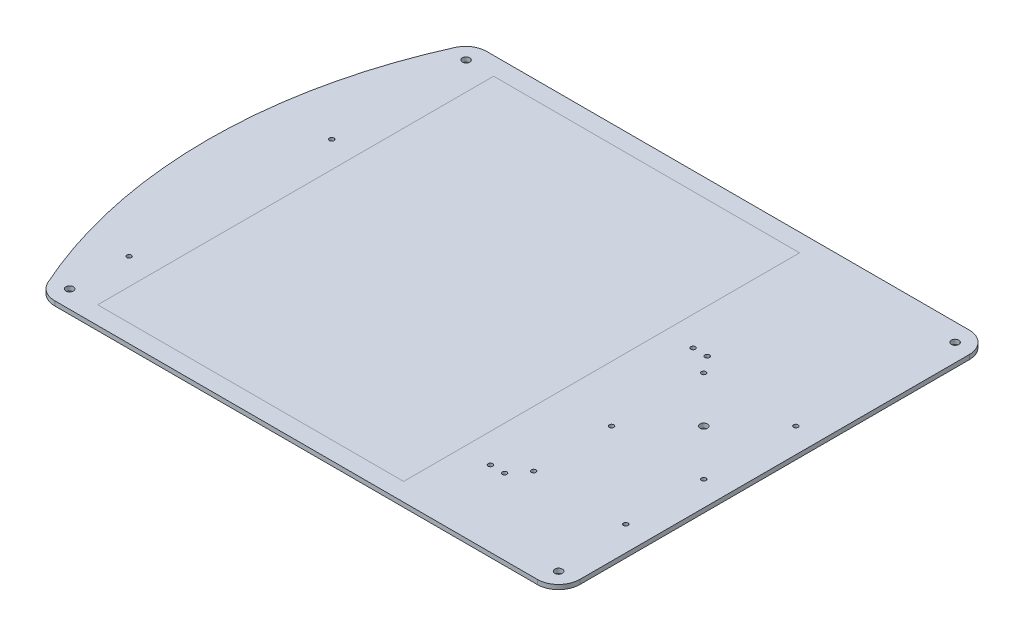
ISO-10303-21;
HEADER;
FILE_DESCRIPTION(('STEP AP214'),'2;1');
FILE_NAME('part.step','',(''),(''),'','','');
FILE_SCHEMA(('AUTOMOTIVE_DESIGN { 1 0 10303 214 1 1 1 1 }'));
ENDSEC;
DATA;
#1=APPLICATION_CONTEXT('core data for automotive mechanical design processes');
#2=APPLICATION_PROTOCOL_DEFINITION('international standard','automotive_design',2000,#1);
#3=PRODUCT_CONTEXT('',#1,'mechanical');
#4=PRODUCT('Part','Part','',(#3));
#5=PRODUCT_RELATED_PRODUCT_CATEGORY('part','',(#4));
#6=PRODUCT_DEFINITION_FORMATION('','',#4);
#7=PRODUCT_DEFINITION_CONTEXT('part definition',#1,'design');
#8=PRODUCT_DEFINITION('design','',#6,#7);
#9=PRODUCT_DEFINITION_SHAPE('','',#8);
#10=(LENGTH_UNIT() NAMED_UNIT(*) SI_UNIT(.MILLI.,.METRE.));
#11=(NAMED_UNIT(*) PLANE_ANGLE_UNIT() SI_UNIT($,.RADIAN.));
#12=(NAMED_UNIT(*) SI_UNIT($,.STERADIAN.) SOLID_ANGLE_UNIT());
#13=UNCERTAINTY_MEASURE_WITH_UNIT(LENGTH_MEASURE(1.E-05),#10,'distance_accuracy_value','');
#14=(GEOMETRIC_REPRESENTATION_CONTEXT(3) GLOBAL_UNCERTAINTY_ASSIGNED_CONTEXT((#13)) GLOBAL_UNIT_ASSIGNED_CONTEXT((#10,
#11,#12)) REPRESENTATION_CONTEXT('',''));
#15=CARTESIAN_POINT('',(0.,0.,0.));
#16=DIRECTION('',(0.,0.,1.));
#17=DIRECTION('',(1.,0.,0.));
#18=AXIS2_PLACEMENT_3D('',#15,#16,#17);
#19=CARTESIAN_POINT('',(0.,0.,0.));
#20=DIRECTION('',(0.,1.,0.));
#21=DIRECTION('',(0.,0.,1.));
#22=AXIS2_PLACEMENT_3D('',#19,#20,#21);
#23=PLANE('',#22);
#24=DIRECTION('',(1.,0.,0.));
#25=VECTOR('',#24,1.);
#26=CARTESIAN_POINT('',(-287.95,0.,139.7));
#27=LINE('',#26,#25);
#28=CARTESIAN_POINT('',(-287.95,0.,139.7));
#29=VERTEX_POINT('',#28);
#30=CARTESIAN_POINT('',(-72.05,0.,139.7));
#31=VERTEX_POINT('',#30);
#32=EDGE_CURVE('E582',#29,#31,#27,.T.);
#33=ORIENTED_EDGE('',*,*,#32,.T.);
#34=DIRECTION('',(0.,0.,-1.));
#35=VECTOR('',#34,1.);
#36=CARTESIAN_POINT('',(-72.0500000000001,0.,-139.7));
#37=LINE('',#36,#35);
#38=CARTESIAN_POINT('',(-72.0500000000001,0.,-139.7));
#39=VERTEX_POINT('',#38);
#40=EDGE_CURVE('E13',#31,#39,#37,.T.);
#41=ORIENTED_EDGE('',*,*,#40,.T.);
#42=DIRECTION('',(-1.,0.,0.));
#43=VECTOR('',#42,1.);
#44=CARTESIAN_POINT('',(-287.95,0.,-139.7));
#45=LINE('',#44,#43);
#46=CARTESIAN_POINT('',(-287.95,0.,-139.7));
#47=VERTEX_POINT('',#46);
#48=EDGE_CURVE('E709',#39,#47,#45,.T.);
#49=ORIENTED_EDGE('',*,*,#48,.T.);
#50=DIRECTION('',(0.,0.,1.));
#51=VECTOR('',#50,1.);
#52=CARTESIAN_POINT('',(-287.95,0.,-139.7));
#53=LINE('',#52,#51);
#54=EDGE_CURVE('E713',#47,#29,#53,.T.);
#55=ORIENTED_EDGE('',*,*,#54,.T.);
#56=EDGE_LOOP('',(#33,#41,#49,#55));
#57=FACE_BOUND('',#56,.T.);
#58=ADVANCED_FACE('F573',(#57),#23,.T.);
#59=CARTESIAN_POINT('',(0.,-3.175,0.));
#60=DIRECTION('',(0.,1.,0.));
#61=DIRECTION('',(0.,0.,1.));
#62=AXIS2_PLACEMENT_3D('',#59,#60,#61);
#63=PLANE('',#62);
#64=CARTESIAN_POINT('',(-306.5,-3.175,99.0000000000001));
#65=DIRECTION('',(0.,1.,0.));
#66=DIRECTION('',(0.,0.,1.));
#67=AXIS2_PLACEMENT_3D('',#64,#65,#66);
#68=CIRCLE('',#67,1.59999999999997);
#69=CARTESIAN_POINT('',(-306.5,-3.175,100.6));
#70=VERTEX_POINT('',#69);
#71=EDGE_CURVE('E901',#70,#70,#68,.F.);
#72=ORIENTED_EDGE('',*,*,#71,.F.);
#73=EDGE_LOOP('',(#72));
#74=FACE_BOUND('',#73,.T.);
#75=CARTESIAN_POINT('',(-51.5,-3.175,-44.0000000000001));
#76=DIRECTION('',(0.,1.,0.));
#77=DIRECTION('',(0.,0.,1.));
#78=AXIS2_PLACEMENT_3D('',#75,#76,#77);
#79=CIRCLE('',#78,1.6);
#80=CARTESIAN_POINT('',(-51.5,-3.175,-42.4000000000002));
#81=VERTEX_POINT('',#80);
#82=EDGE_CURVE('E900',#81,#81,#79,.F.);
#83=ORIENTED_EDGE('',*,*,#82,.F.);
#84=EDGE_LOOP('',(#83));
#85=FACE_BOUND('',#84,.T.);
#86=CARTESIAN_POINT('',(-41.5,-3.175,-44.0000000000001));
#87=DIRECTION('',(0.,1.,0.));
#88=DIRECTION('',(0.,0.,1.));
#89=AXIS2_PLACEMENT_3D('',#86,#87,#88);
#90=CIRCLE('',#89,1.6);
#91=CARTESIAN_POINT('',(-41.5,-3.175,-42.4000000000002));
#92=VERTEX_POINT('',#91);
#93=EDGE_CURVE('E909',#92,#92,#90,.F.);
#94=ORIENTED_EDGE('',*,*,#93,.F.);
#95=EDGE_LOOP('',(#94));
#96=FACE_BOUND('',#95,.T.);
#97=CARTESIAN_POINT('',(-51.5,-3.175,99.0000000000001));
#98=DIRECTION('',(0.,1.,0.));
#99=DIRECTION('',(0.,0.,1.));
#100=AXIS2_PLACEMENT_3D('',#97,#98,#99);
#101=CIRCLE('',#100,1.6);
#102=CARTESIAN_POINT('',(-51.5,-3.175,100.6));
#103=VERTEX_POINT('',#102);
#104=EDGE_CURVE('E908',#103,#103,#101,.F.);
#105=ORIENTED_EDGE('',*,*,#104,.F.);
#106=EDGE_LOOP('',(#105));
#107=FACE_BOUND('',#106,.T.);
#108=CARTESIAN_POINT('',(-306.5,-3.175,-44.0000000000001));
#109=DIRECTION('',(0.,1.,0.));
#110=DIRECTION('',(0.,0.,1.));
#111=AXIS2_PLACEMENT_3D('',#108,#109,#110);
#112=CIRCLE('',#111,1.59999999999996);
#113=CARTESIAN_POINT('',(-306.5,-3.175,-42.4000000000001));
#114=VERTEX_POINT('',#113);
#115=EDGE_CURVE('E895',#114,#114,#112,.F.);
#116=ORIENTED_EDGE('',*,*,#115,.F.);
#117=EDGE_LOOP('',(#116));
#118=FACE_BOUND('',#117,.T.);
#119=CARTESIAN_POINT('',(-41.5,-3.175,99.0000000000001));
#120=DIRECTION('',(0.,1.,0.));
#121=DIRECTION('',(0.,0.,1.));
#122=AXIS2_PLACEMENT_3D('',#119,#120,#121);
#123=CIRCLE('',#122,1.6);
#124=CARTESIAN_POINT('',(-41.5,-3.175,100.6));
#125=VERTEX_POINT('',#124);
#126=EDGE_CURVE('E916',#125,#125,#123,.F.);
#127=ORIENTED_EDGE('',*,*,#126,.F.);
#128=EDGE_LOOP('',(#127));
#129=FACE_BOUND('',#128,.T.);
#130=DIRECTION('',(0.,0.,1.));
#131=VECTOR('',#130,1.);
#132=CARTESIAN_POINT('',(50.,-3.175,-50.));
#133=LINE('',#132,#131);
#134=CARTESIAN_POINT('',(50.,-3.175,-137.4));
#135=VERTEX_POINT('',#134);
#136=CARTESIAN_POINT('',(50.,-3.175,137.4));
#137=VERTEX_POINT('',#136);
#138=EDGE_CURVE('E787',#135,#137,#133,.T.);
#139=ORIENTED_EDGE('',*,*,#138,.T.);
#140=CARTESIAN_POINT('',(35.,-3.175,137.4));
#141=DIRECTION('',(0.,1.,0.));
#142=DIRECTION('',(0.,0.,1.));
#143=AXIS2_PLACEMENT_3D('',#140,#141,#142);
#144=CIRCLE('',#143,15.);
#145=CARTESIAN_POINT('',(35.,-3.175,152.4));
#146=VERTEX_POINT('',#145);
#147=EDGE_CURVE('E697',#137,#146,#144,.F.);
#148=ORIENTED_EDGE('',*,*,#147,.T.);
#149=DIRECTION('',(-1.,0.,0.));
#150=VECTOR('',#149,1.);
#151=CARTESIAN_POINT('',(50.,-3.175,152.4));
#152=LINE('',#151,#150);
#153=CARTESIAN_POINT('',(-305.526169091945,-3.175,152.4));
#154=VERTEX_POINT('',#153);
#155=EDGE_CURVE('E666',#146,#154,#152,.T.);
#156=ORIENTED_EDGE('',*,*,#155,.T.);
#157=CARTESIAN_POINT('',(-305.526169091945,-3.175,137.4));
#158=DIRECTION('',(0.,1.,0.));
#159=DIRECTION('',(0.,0.,1.));
#160=AXIS2_PLACEMENT_3D('',#157,#158,#159);
#161=CIRCLE('',#160,15.);
#162=CARTESIAN_POINT('',(-319.206445319943,-3.175,143.55223880597));
#163=VERTEX_POINT('',#162);
#164=EDGE_CURVE('E693',#154,#163,#161,.F.);
#165=ORIENTED_EDGE('',*,*,#164,.T.);
#166=CARTESIAN_POINT('',(0.,-3.175,0.));
#167=DIRECTION('',(0.,-1.,0.));
#168=DIRECTION('',(0.,0.,1.));
#169=AXIS2_PLACEMENT_3D('',#166,#167,#168);
#170=CIRCLE('',#169,350.);
#171=CARTESIAN_POINT('',(-319.206445319943,-3.175,-143.55223880597));
#172=VERTEX_POINT('',#171);
#173=EDGE_CURVE('E674',#163,#172,#170,.T.);
#174=ORIENTED_EDGE('',*,*,#173,.T.);
#175=CARTESIAN_POINT('',(-305.526169091945,-3.175,-137.4));
#176=DIRECTION('',(0.,1.,0.));
#177=DIRECTION('',(0.,0.,1.));
#178=AXIS2_PLACEMENT_3D('',#175,#176,#177);
#179=CIRCLE('',#178,15.);
#180=CARTESIAN_POINT('',(-305.526169091945,-3.175,-152.4));
#181=VERTEX_POINT('',#180);
#182=EDGE_CURVE('E691',#172,#181,#179,.F.);
#183=ORIENTED_EDGE('',*,*,#182,.T.);
#184=DIRECTION('',(1.,0.,0.));
#185=VECTOR('',#184,1.);
#186=CARTESIAN_POINT('',(-315.078149036076,-3.175,-152.4));
#187=LINE('',#186,#185);
#188=CARTESIAN_POINT('',(35.,-3.175,-152.4));
#189=VERTEX_POINT('',#188);
#190=EDGE_CURVE('E678',#181,#189,#187,.T.);
#191=ORIENTED_EDGE('',*,*,#190,.T.);
#192=CARTESIAN_POINT('',(35.,-3.175,-137.4));
#193=DIRECTION('',(0.,1.,0.));
#194=DIRECTION('',(0.,0.,1.));
#195=AXIS2_PLACEMENT_3D('',#192,#193,#194);
#196=CIRCLE('',#195,15.);
#197=EDGE_CURVE('E695',#189,#135,#196,.F.);
#198=ORIENTED_EDGE('',*,*,#197,.T.);
#199=EDGE_LOOP('',(#139,#148,#156,#165,#174,#183,#191,#198));
#200=FACE_BOUND('',#199,.T.);
#201=CARTESIAN_POINT('',(32.5,-3.175,-32.5));
#202=DIRECTION('',(0.,-1.,0.));
#203=DIRECTION('',(0.,0.,-1.));
#204=AXIS2_PLACEMENT_3D('',#201,#202,#203);
#205=CIRCLE('',#204,1.6);
#206=CARTESIAN_POINT('',(32.5,-3.175,-34.1));
#207=VERTEX_POINT('',#206);
#208=EDGE_CURVE('E779',#207,#207,#205,.T.);
#209=ORIENTED_EDGE('',*,*,#208,.F.);
#210=EDGE_LOOP('',(#209));
#211=FACE_BOUND('',#210,.T.);
#212=CARTESIAN_POINT('',(32.5,-3.175,32.5));
#213=DIRECTION('',(0.,-1.,0.));
#214=DIRECTION('',(0.,0.,-1.));
#215=AXIS2_PLACEMENT_3D('',#212,#213,#214);
#216=CIRCLE('',#215,1.6);
#217=CARTESIAN_POINT('',(32.5,-3.175,30.9));
#218=VERTEX_POINT('',#217);
#219=EDGE_CURVE('E768',#218,#218,#216,.T.);
#220=ORIENTED_EDGE('',*,*,#219,.F.);
#221=EDGE_LOOP('',(#220));
#222=FACE_BOUND('',#221,.T.);
#223=CARTESIAN_POINT('',(-32.5,-3.175,-32.5));
#224=DIRECTION('',(0.,-1.,0.));
#225=DIRECTION('',(0.,0.,-1.));
#226=AXIS2_PLACEMENT_3D('',#223,#224,#225);
#227=CIRCLE('',#226,1.6);
#228=CARTESIAN_POINT('',(-32.5,-3.175,-34.1));
#229=VERTEX_POINT('',#228);
#230=EDGE_CURVE('E769',#229,#229,#227,.T.);
#231=ORIENTED_EDGE('',*,*,#230,.F.);
#232=EDGE_LOOP('',(#231));
#233=FACE_BOUND('',#232,.T.);
#234=CARTESIAN_POINT('',(-32.5,-3.175,32.5));
#235=DIRECTION('',(0.,-1.,0.));
#236=DIRECTION('',(0.,0.,-1.));
#237=AXIS2_PLACEMENT_3D('',#234,#235,#236);
#238=CIRCLE('',#237,1.6);
#239=CARTESIAN_POINT('',(-32.5,-3.175,30.9));
#240=VERTEX_POINT('',#239);
#241=EDGE_CURVE('E955',#240,#240,#238,.T.);
#242=ORIENTED_EDGE('',*,*,#241,.F.);
#243=EDGE_LOOP('',(#242));
#244=FACE_BOUND('',#243,.T.);
#245=CARTESIAN_POINT('',(-32.5,-3.175,87.5));
#246=DIRECTION('',(0.,-1.,0.));
#247=DIRECTION('',(0.,0.,-1.));
#248=AXIS2_PLACEMENT_3D('',#245,#246,#247);
#249=CIRCLE('',#248,1.6);
#250=CARTESIAN_POINT('',(-32.5,-3.175,85.9));
#251=VERTEX_POINT('',#250);
#252=EDGE_CURVE('E950',#251,#251,#249,.T.);
#253=ORIENTED_EDGE('',*,*,#252,.F.);
#254=EDGE_LOOP('',(#253));
#255=FACE_BOUND('',#254,.T.);
#256=CARTESIAN_POINT('',(32.5,-3.175,87.5));
#257=DIRECTION('',(0.,-1.,0.));
#258=DIRECTION('',(0.,0.,-1.));
#259=AXIS2_PLACEMENT_3D('',#256,#257,#258);
#260=CIRCLE('',#259,1.6);
#261=CARTESIAN_POINT('',(32.5,-3.175,85.9));
#262=VERTEX_POINT('',#261);
#263=EDGE_CURVE('E945',#262,#262,#260,.T.);
#264=ORIENTED_EDGE('',*,*,#263,.F.);
#265=EDGE_LOOP('',(#264));
#266=FACE_BOUND('',#265,.T.);
#267=CARTESIAN_POINT('',(0.,-3.175,0.));
#268=DIRECTION('',(0.,-1.,0.));
#269=DIRECTION('',(0.,0.,-1.));
#270=AXIS2_PLACEMENT_3D('',#267,#268,#269);
#271=CIRCLE('',#270,2.65);
#272=CARTESIAN_POINT('',(0.,-3.175,-2.65));
#273=VERTEX_POINT('',#272);
#274=EDGE_CURVE('E940',#273,#273,#271,.T.);
#275=ORIENTED_EDGE('',*,*,#274,.F.);
#276=EDGE_LOOP('',(#275));
#277=FACE_BOUND('',#276,.T.);
#278=CARTESIAN_POINT('',(37.5,-3.175,-139.9));
#279=DIRECTION('',(0.,-1.,0.));
#280=DIRECTION('',(0.,0.,-1.));
#281=AXIS2_PLACEMENT_3D('',#278,#279,#280);
#282=CIRCLE('',#281,2.65);
#283=CARTESIAN_POINT('',(37.5,-3.175,-142.55));
#284=VERTEX_POINT('',#283);
#285=EDGE_CURVE('E935',#284,#284,#282,.T.);
#286=ORIENTED_EDGE('',*,*,#285,.F.);
#287=EDGE_LOOP('',(#286));
#288=FACE_BOUND('',#287,.T.);
#289=CARTESIAN_POINT('',(-307.578149036076,-3.175,-139.9));
#290=DIRECTION('',(0.,-1.,0.));
#291=DIRECTION('',(0.,0.,-1.));
#292=AXIS2_PLACEMENT_3D('',#289,#290,#291);
#293=CIRCLE('',#292,2.64999999999998);
#294=CARTESIAN_POINT('',(-307.578149036076,-3.175,-142.55));
#295=VERTEX_POINT('',#294);
#296=EDGE_CURVE('E930',#295,#295,#293,.T.);
#297=ORIENTED_EDGE('',*,*,#296,.F.);
#298=EDGE_LOOP('',(#297));
#299=FACE_BOUND('',#298,.T.);
#300=CARTESIAN_POINT('',(-307.578149036076,-3.175,139.9));
#301=DIRECTION('',(0.,-1.,0.));
#302=DIRECTION('',(0.,0.,1.));
#303=AXIS2_PLACEMENT_3D('',#300,#301,#302);
#304=CIRCLE('',#303,2.64999999999998);
#305=CARTESIAN_POINT('',(-307.578149036076,-3.175,142.55));
#306=VERTEX_POINT('',#305);
#307=EDGE_CURVE('E925',#306,#306,#304,.T.);
#308=ORIENTED_EDGE('',*,*,#307,.F.);
#309=EDGE_LOOP('',(#308));
#310=FACE_BOUND('',#309,.T.);
#311=CARTESIAN_POINT('',(37.5,-3.175,139.9));
#312=DIRECTION('',(0.,-1.,0.));
#313=DIRECTION('',(0.,0.,1.));
#314=AXIS2_PLACEMENT_3D('',#311,#312,#313);
#315=CIRCLE('',#314,2.65);
#316=CARTESIAN_POINT('',(37.5,-3.175,142.55));
#317=VERTEX_POINT('',#316);
#318=EDGE_CURVE('E920',#317,#317,#315,.T.);
#319=ORIENTED_EDGE('',*,*,#318,.F.);
#320=EDGE_LOOP('',(#319));
#321=FACE_BOUND('',#320,.T.);
#322=ADVANCED_FACE('F722',(#74,#85,#96,#107,#118,#129,#200,#211,#222,#233,#244,#255,#266,#277,
#288,#299,#310,#321),#63,.F.);
#323=ORIENTED_EDGE('',*,*,#40,.F.);
#324=ORIENTED_EDGE('',*,*,#32,.F.);
#325=ORIENTED_EDGE('',*,*,#54,.F.);
#326=ORIENTED_EDGE('',*,*,#48,.F.);
#327=EDGE_LOOP('',(#323,#324,#325,#326));
#328=FACE_BOUND('',#327,.T.);
#329=CARTESIAN_POINT('',(-306.5,0.,99.0000000000001));
#330=DIRECTION('',(0.,1.,0.));
#331=DIRECTION('',(0.,0.,1.));
#332=AXIS2_PLACEMENT_3D('',#329,#330,#331);
#333=CIRCLE('',#332,1.59999999999997);
#334=CARTESIAN_POINT('',(-306.5,0.,100.6));
#335=VERTEX_POINT('',#334);
#336=EDGE_CURVE('E727',#335,#335,#333,.T.);
#337=ORIENTED_EDGE('',*,*,#336,.F.);
#338=EDGE_LOOP('',(#337));
#339=FACE_BOUND('',#338,.T.);
#340=CARTESIAN_POINT('',(-51.5,0.,-44.0000000000001));
#341=DIRECTION('',(0.,1.,0.));
#342=DIRECTION('',(0.,0.,1.));
#343=AXIS2_PLACEMENT_3D('',#340,#341,#342);
#344=CIRCLE('',#343,1.6);
#345=CARTESIAN_POINT('',(-51.5,0.,-42.4000000000002));
#346=VERTEX_POINT('',#345);
#347=EDGE_CURVE('E731',#346,#346,#344,.T.);
#348=ORIENTED_EDGE('',*,*,#347,.F.);
#349=EDGE_LOOP('',(#348));
#350=FACE_BOUND('',#349,.T.);
#351=CARTESIAN_POINT('',(-41.5,0.,-44.0000000000001));
#352=DIRECTION('',(0.,1.,0.));
#353=DIRECTION('',(0.,0.,1.));
#354=AXIS2_PLACEMENT_3D('',#351,#352,#353);
#355=CIRCLE('',#354,1.6);
#356=CARTESIAN_POINT('',(-41.5,0.,-42.4000000000002));
#357=VERTEX_POINT('',#356);
#358=EDGE_CURVE('E735',#357,#357,#355,.T.);
#359=ORIENTED_EDGE('',*,*,#358,.F.);
#360=EDGE_LOOP('',(#359));
#361=FACE_BOUND('',#360,.T.);
#362=CARTESIAN_POINT('',(-51.5,0.,99.0000000000001));
#363=DIRECTION('',(0.,1.,0.));
#364=DIRECTION('',(0.,0.,1.));
#365=AXIS2_PLACEMENT_3D('',#362,#363,#364);
#366=CIRCLE('',#365,1.6);
#367=CARTESIAN_POINT('',(-51.5,0.,100.6));
#368=VERTEX_POINT('',#367);
#369=EDGE_CURVE('E739',#368,#368,#366,.T.);
#370=ORIENTED_EDGE('',*,*,#369,.F.);
#371=EDGE_LOOP('',(#370));
#372=FACE_BOUND('',#371,.T.);
#373=CARTESIAN_POINT('',(-306.5,0.,-44.0000000000001));
#374=DIRECTION('',(0.,1.,0.));
#375=DIRECTION('',(0.,0.,1.));
#376=AXIS2_PLACEMENT_3D('',#373,#374,#375);
#377=CIRCLE('',#376,1.59999999999996);
#378=CARTESIAN_POINT('',(-306.5,0.,-42.4000000000001));
#379=VERTEX_POINT('',#378);
#380=EDGE_CURVE('E743',#379,#379,#377,.T.);
#381=ORIENTED_EDGE('',*,*,#380,.F.);
#382=EDGE_LOOP('',(#381));
#383=FACE_BOUND('',#382,.T.);
#384=CARTESIAN_POINT('',(-41.5,0.,99.0000000000001));
#385=DIRECTION('',(0.,1.,0.));
#386=DIRECTION('',(0.,0.,1.));
#387=AXIS2_PLACEMENT_3D('',#384,#385,#386);
#388=CIRCLE('',#387,1.6);
#389=CARTESIAN_POINT('',(-41.5,0.,100.6));
#390=VERTEX_POINT('',#389);
#391=EDGE_CURVE('E747',#390,#390,#388,.T.);
#392=ORIENTED_EDGE('',*,*,#391,.F.);
#393=EDGE_LOOP('',(#392));
#394=FACE_BOUND('',#393,.T.);
#395=CARTESIAN_POINT('',(-307.578149036076,0.,139.9));
#396=DIRECTION('',(0.,-1.,0.));
#397=DIRECTION('',(0.,0.,1.));
#398=AXIS2_PLACEMENT_3D('',#395,#396,#397);
#399=CIRCLE('',#398,2.64999999999998);
#400=CARTESIAN_POINT('',(-307.578149036076,0.,142.55));
#401=VERTEX_POINT('',#400);
#402=EDGE_CURVE('E751',#401,#401,#399,.T.);
#403=ORIENTED_EDGE('',*,*,#402,.T.);
#404=EDGE_LOOP('',(#403));
#405=FACE_BOUND('',#404,.T.);
#406=CARTESIAN_POINT('',(37.5,0.,-139.9));
#407=DIRECTION('',(0.,-1.,0.));
#408=DIRECTION('',(0.,0.,-1.));
#409=AXIS2_PLACEMENT_3D('',#406,#407,#408);
#410=CIRCLE('',#409,2.65);
#411=CARTESIAN_POINT('',(37.5,0.,-142.55));
#412=VERTEX_POINT('',#411);
#413=EDGE_CURVE('E755',#412,#412,#410,.T.);
#414=ORIENTED_EDGE('',*,*,#413,.T.);
#415=EDGE_LOOP('',(#414));
#416=FACE_BOUND('',#415,.T.);
#417=CARTESIAN_POINT('',(32.5,0.,87.5));
#418=DIRECTION('',(0.,-1.,0.));
#419=DIRECTION('',(0.,0.,-1.));
#420=AXIS2_PLACEMENT_3D('',#417,#418,#419);
#421=CIRCLE('',#420,1.6);
#422=CARTESIAN_POINT('',(32.5,0.,85.9));
#423=VERTEX_POINT('',#422);
#424=EDGE_CURVE('E759',#423,#423,#421,.T.);
#425=ORIENTED_EDGE('',*,*,#424,.T.);
#426=EDGE_LOOP('',(#425));
#427=FACE_BOUND('',#426,.T.);
#428=CARTESIAN_POINT('',(-32.5,0.,32.5));
#429=DIRECTION('',(0.,-1.,0.));
#430=DIRECTION('',(0.,0.,-1.));
#431=AXIS2_PLACEMENT_3D('',#428,#429,#430);
#432=CIRCLE('',#431,1.6);
#433=CARTESIAN_POINT('',(-32.5,0.,30.9));
#434=VERTEX_POINT('',#433);
#435=EDGE_CURVE('E763',#434,#434,#432,.T.);
#436=ORIENTED_EDGE('',*,*,#435,.T.);
#437=EDGE_LOOP('',(#436));
#438=FACE_BOUND('',#437,.T.);
#439=CARTESIAN_POINT('',(32.5,0.,32.5));
#440=DIRECTION('',(0.,-1.,0.));
#441=DIRECTION('',(0.,0.,-1.));
#442=AXIS2_PLACEMENT_3D('',#439,#440,#441);
#443=CIRCLE('',#442,1.6);
#444=CARTESIAN_POINT('',(32.5,0.,30.9));
#445=VERTEX_POINT('',#444);
#446=EDGE_CURVE('E766',#445,#445,#443,.T.);
#447=ORIENTED_EDGE('',*,*,#446,.T.);
#448=EDGE_LOOP('',(#447));
#449=FACE_BOUND('',#448,.T.);
#450=DIRECTION('',(-1.,0.,0.));
#451=VECTOR('',#450,1.);
#452=CARTESIAN_POINT('',(-315.078149036076,0.,152.4));
#453=LINE('',#452,#451);
#454=CARTESIAN_POINT('',(35.,0.,152.4));
#455=VERTEX_POINT('',#454);
#456=CARTESIAN_POINT('',(-305.526169091945,0.,152.4));
#457=VERTEX_POINT('',#456);
#458=EDGE_CURVE('E663',#455,#457,#453,.T.);
#459=ORIENTED_EDGE('',*,*,#458,.F.);
#460=CARTESIAN_POINT('',(35.,0.,137.4));
#461=DIRECTION('',(0.,1.,0.));
#462=DIRECTION('',(0.,0.,1.));
#463=AXIS2_PLACEMENT_3D('',#460,#461,#462);
#464=CIRCLE('',#463,15.);
#465=CARTESIAN_POINT('',(50.,0.,137.4));
#466=VERTEX_POINT('',#465);
#467=EDGE_CURVE('E646',#455,#466,#464,.T.);
#468=ORIENTED_EDGE('',*,*,#467,.T.);
#469=DIRECTION('',(0.,0.,1.));
#470=VECTOR('',#469,1.);
#471=CARTESIAN_POINT('',(50.,0.,50.));
#472=LINE('',#471,#470);
#473=CARTESIAN_POINT('',(50.,0.,-137.4));
#474=VERTEX_POINT('',#473);
#475=EDGE_CURVE('E675',#474,#466,#472,.T.);
#476=ORIENTED_EDGE('',*,*,#475,.F.);
#477=CARTESIAN_POINT('',(35.,0.,-137.4));
#478=DIRECTION('',(0.,1.,0.));
#479=DIRECTION('',(0.,0.,1.));
#480=AXIS2_PLACEMENT_3D('',#477,#478,#479);
#481=CIRCLE('',#480,15.);
#482=CARTESIAN_POINT('',(35.,0.,-152.4));
#483=VERTEX_POINT('',#482);
#484=EDGE_CURVE('E657',#474,#483,#481,.T.);
#485=ORIENTED_EDGE('',*,*,#484,.T.);
#486=DIRECTION('',(1.,0.,0.));
#487=VECTOR('',#486,1.);
#488=CARTESIAN_POINT('',(50.,0.,-152.4));
#489=LINE('',#488,#487);
#490=CARTESIAN_POINT('',(-305.526169091945,0.,-152.4));
#491=VERTEX_POINT('',#490);
#492=EDGE_CURVE('E680',#491,#483,#489,.T.);
#493=ORIENTED_EDGE('',*,*,#492,.F.);
#494=CARTESIAN_POINT('',(-305.526169091945,0.,-137.4));
#495=DIRECTION('',(0.,1.,0.));
#496=DIRECTION('',(0.,0.,1.));
#497=AXIS2_PLACEMENT_3D('',#494,#495,#496);
#498=CIRCLE('',#497,15.);
#499=CARTESIAN_POINT('',(-319.206445319943,0.,-143.55223880597));
#500=VERTEX_POINT('',#499);
#501=EDGE_CURVE('E667',#491,#500,#498,.T.);
#502=ORIENTED_EDGE('',*,*,#501,.T.);
#503=CARTESIAN_POINT('',(0.,0.,0.));
#504=DIRECTION('',(0.,-1.,0.));
#505=DIRECTION('',(0.,0.,1.));
#506=AXIS2_PLACEMENT_3D('',#503,#504,#505);
#507=CIRCLE('',#506,350.);
#508=CARTESIAN_POINT('',(-319.206445319943,0.,143.55223880597));
#509=VERTEX_POINT('',#508);
#510=EDGE_CURVE('E782',#509,#500,#507,.T.);
#511=ORIENTED_EDGE('',*,*,#510,.F.);
#512=CARTESIAN_POINT('',(-305.526169091945,0.,137.4));
#513=DIRECTION('',(0.,1.,0.));
#514=DIRECTION('',(0.,0.,1.));
#515=AXIS2_PLACEMENT_3D('',#512,#513,#514);
#516=CIRCLE('',#515,15.);
#517=EDGE_CURVE('E673',#509,#457,#516,.T.);
#518=ORIENTED_EDGE('',*,*,#517,.T.);
#519=EDGE_LOOP('',(#459,#468,#476,#485,#493,#502,#511,#518));
#520=FACE_BOUND('',#519,.T.);
#521=CARTESIAN_POINT('',(32.5,0.,-32.5));
#522=DIRECTION('',(0.,-1.,0.));
#523=DIRECTION('',(0.,0.,-1.));
#524=AXIS2_PLACEMENT_3D('',#521,#522,#523);
#525=CIRCLE('',#524,1.6);
#526=CARTESIAN_POINT('',(32.5,0.,-34.1));
#527=VERTEX_POINT('',#526);
#528=EDGE_CURVE('E772',#527,#527,#525,.T.);
#529=ORIENTED_EDGE('',*,*,#528,.T.);
#530=EDGE_LOOP('',(#529));
#531=FACE_BOUND('',#530,.T.);
#532=CARTESIAN_POINT('',(-32.5,0.,-32.5));
#533=DIRECTION('',(0.,-1.,0.));
#534=DIRECTION('',(0.,0.,-1.));
#535=AXIS2_PLACEMENT_3D('',#532,#533,#534);
#536=CIRCLE('',#535,1.6);
#537=CARTESIAN_POINT('',(-32.5,0.,-34.1));
#538=VERTEX_POINT('',#537);
#539=EDGE_CURVE('E775',#538,#538,#536,.T.);
#540=ORIENTED_EDGE('',*,*,#539,.T.);
#541=EDGE_LOOP('',(#540));
#542=FACE_BOUND('',#541,.T.);
#543=CARTESIAN_POINT('',(-32.5,0.,87.5));
#544=DIRECTION('',(0.,-1.,0.));
#545=DIRECTION('',(0.,0.,-1.));
#546=AXIS2_PLACEMENT_3D('',#543,#544,#545);
#547=CIRCLE('',#546,1.6);
#548=CARTESIAN_POINT('',(-32.5,0.,85.9));
#549=VERTEX_POINT('',#548);
#550=EDGE_CURVE('E948',#549,#549,#547,.T.);
#551=ORIENTED_EDGE('',*,*,#550,.T.);
#552=EDGE_LOOP('',(#551));
#553=FACE_BOUND('',#552,.T.);
#554=CARTESIAN_POINT('',(0.,0.,0.));
#555=DIRECTION('',(0.,-1.,0.));
#556=DIRECTION('',(0.,0.,-1.));
#557=AXIS2_PLACEMENT_3D('',#554,#555,#556);
#558=CIRCLE('',#557,2.65);
#559=CARTESIAN_POINT('',(0.,0.,-2.65));
#560=VERTEX_POINT('',#559);
#561=EDGE_CURVE('E938',#560,#560,#558,.T.);
#562=ORIENTED_EDGE('',*,*,#561,.T.);
#563=EDGE_LOOP('',(#562));
#564=FACE_BOUND('',#563,.T.);
#565=CARTESIAN_POINT('',(-307.578149036076,0.,-139.9));
#566=DIRECTION('',(0.,-1.,0.));
#567=DIRECTION('',(0.,0.,-1.));
#568=AXIS2_PLACEMENT_3D('',#565,#566,#567);
#569=CIRCLE('',#568,2.64999999999998);
#570=CARTESIAN_POINT('',(-307.578149036076,0.,-142.55));
#571=VERTEX_POINT('',#570);
#572=EDGE_CURVE('E928',#571,#571,#569,.T.);
#573=ORIENTED_EDGE('',*,*,#572,.T.);
#574=EDGE_LOOP('',(#573));
#575=FACE_BOUND('',#574,.T.);
#576=CARTESIAN_POINT('',(37.5,0.,139.9));
#577=DIRECTION('',(0.,-1.,0.));
#578=DIRECTION('',(0.,0.,1.));
#579=AXIS2_PLACEMENT_3D('',#576,#577,#578);
#580=CIRCLE('',#579,2.65);
#581=CARTESIAN_POINT('',(37.5,0.,142.55));
#582=VERTEX_POINT('',#581);
#583=EDGE_CURVE('E919',#582,#582,#580,.T.);
#584=ORIENTED_EDGE('',*,*,#583,.T.);
#585=EDGE_LOOP('',(#584));
#586=FACE_BOUND('',#585,.T.);
#587=ADVANCED_FACE('F670',(#328,#339,#350,#361,#372,#383,#394,#405,#416,#427,#438,#449,#520,
#531,#542,#553,#564,#575,#586),#23,.T.);
#588=CARTESIAN_POINT('',(0.,-3.175,0.));
#589=DIRECTION('',(0.,1.,0.));
#590=DIRECTION('',(0.,0.,1.));
#591=AXIS2_PLACEMENT_3D('',#588,#589,#590);
#592=CYLINDRICAL_SURFACE('',#591,350.);
#593=ORIENTED_EDGE('',*,*,#173,.F.);
#594=DIRECTION('',(0.,1.,0.));
#595=VECTOR('',#594,1.);
#596=CARTESIAN_POINT('',(-319.206445319943,-3.175,143.55223880597));
#597=LINE('',#596,#595);
#598=EDGE_CURVE('E706',#163,#509,#597,.T.);
#599=ORIENTED_EDGE('',*,*,#598,.T.);
#600=ORIENTED_EDGE('',*,*,#510,.T.);
#601=DIRECTION('',(0.,1.,0.));
#602=VECTOR('',#601,1.);
#603=CARTESIAN_POINT('',(-319.206445319943,-3.175,-143.55223880597));
#604=LINE('',#603,#602);
#605=EDGE_CURVE('E704',#500,#172,#604,.F.);
#606=ORIENTED_EDGE('',*,*,#605,.T.);
#607=EDGE_LOOP('',(#593,#599,#600,#606));
#608=FACE_BOUND('',#607,.T.);
#609=ADVANCED_FACE('F721',(#608),#592,.T.);
#610=CARTESIAN_POINT('',(50.,-3.175,-152.4));
#611=DIRECTION('',(0.,0.,1.));
#612=DIRECTION('',(1.,0.,0.));
#613=AXIS2_PLACEMENT_3D('',#610,#611,#612);
#614=PLANE('',#613);
#615=ORIENTED_EDGE('',*,*,#492,.T.);
#616=DIRECTION('',(0.,1.,0.));
#617=VECTOR('',#616,1.);
#618=CARTESIAN_POINT('',(35.,-3.175,-152.4));
#619=LINE('',#618,#617);
#620=EDGE_CURVE('E702',#483,#189,#619,.F.);
#621=ORIENTED_EDGE('',*,*,#620,.T.);
#622=ORIENTED_EDGE('',*,*,#190,.F.);
#623=DIRECTION('',(0.,1.,0.));
#624=VECTOR('',#623,1.);
#625=CARTESIAN_POINT('',(-305.526169091945,-3.175,-152.4));
#626=LINE('',#625,#624);
#627=EDGE_CURVE('E699',#181,#491,#626,.T.);
#628=ORIENTED_EDGE('',*,*,#627,.T.);
#629=EDGE_LOOP('',(#615,#621,#622,#628));
#630=FACE_BOUND('',#629,.T.);
#631=ADVANCED_FACE('F796',(#630),#614,.F.);
#632=CARTESIAN_POINT('',(50.,-3.175,50.));
#633=DIRECTION('',(-1.,0.,0.));
#634=DIRECTION('',(0.,0.,1.));
#635=AXIS2_PLACEMENT_3D('',#632,#633,#634);
#636=PLANE('',#635);
#637=ORIENTED_EDGE('',*,*,#475,.T.);
#638=DIRECTION('',(0.,1.,0.));
#639=VECTOR('',#638,1.);
#640=CARTESIAN_POINT('',(50.,-3.175,137.4));
#641=LINE('',#640,#639);
#642=EDGE_CURVE('E651',#466,#137,#641,.F.);
#643=ORIENTED_EDGE('',*,*,#642,.T.);
#644=ORIENTED_EDGE('',*,*,#138,.F.);
#645=DIRECTION('',(0.,1.,0.));
#646=VECTOR('',#645,1.);
#647=CARTESIAN_POINT('',(50.,-3.175,-137.4));
#648=LINE('',#647,#646);
#649=EDGE_CURVE('E656',#135,#474,#648,.T.);
#650=ORIENTED_EDGE('',*,*,#649,.T.);
#651=EDGE_LOOP('',(#637,#643,#644,#650));
#652=FACE_BOUND('',#651,.T.);
#653=ADVANCED_FACE('F807',(#652),#636,.F.);
#654=CARTESIAN_POINT('',(-315.078149036076,-3.175,152.4));
#655=DIRECTION('',(0.,0.,-1.));
#656=DIRECTION('',(-1.,0.,0.));
#657=AXIS2_PLACEMENT_3D('',#654,#655,#656);
#658=PLANE('',#657);
#659=ORIENTED_EDGE('',*,*,#155,.F.);
#660=DIRECTION('',(0.,1.,0.));
#661=VECTOR('',#660,1.);
#662=CARTESIAN_POINT('',(35.,-3.175,152.4));
#663=LINE('',#662,#661);
#664=EDGE_CURVE('E650',#146,#455,#663,.T.);
#665=ORIENTED_EDGE('',*,*,#664,.T.);
#666=ORIENTED_EDGE('',*,*,#458,.T.);
#667=DIRECTION('',(0.,1.,0.));
#668=VECTOR('',#667,1.);
#669=CARTESIAN_POINT('',(-305.526169091945,-3.175,152.4));
#670=LINE('',#669,#668);
#671=EDGE_CURVE('E668',#457,#154,#670,.F.);
#672=ORIENTED_EDGE('',*,*,#671,.T.);
#673=EDGE_LOOP('',(#659,#665,#666,#672));
#674=FACE_BOUND('',#673,.T.);
#675=ADVANCED_FACE('F662',(#674),#658,.F.);
#676=CARTESIAN_POINT('',(32.5,-3.175,-32.5));
#677=DIRECTION('',(0.,1.,0.));
#678=DIRECTION('',(0.,0.,1.));
#679=AXIS2_PLACEMENT_3D('',#676,#677,#678);
#680=CYLINDRICAL_SURFACE('',#679,1.6);
#681=ORIENTED_EDGE('',*,*,#208,.T.);
#682=EDGE_LOOP('',(#681));
#683=FACE_BOUND('',#682,.T.);
#684=ORIENTED_EDGE('',*,*,#528,.F.);
#685=EDGE_LOOP('',(#684));
#686=FACE_BOUND('',#685,.T.);
#687=ADVANCED_FACE('F814',(#683,#686),#680,.F.);
#688=CARTESIAN_POINT('',(32.5,-3.175,32.5));
#689=DIRECTION('',(0.,1.,0.));
#690=DIRECTION('',(0.,0.,1.));
#691=AXIS2_PLACEMENT_3D('',#688,#689,#690);
#692=CYLINDRICAL_SURFACE('',#691,1.6);
#693=ORIENTED_EDGE('',*,*,#219,.T.);
#694=EDGE_LOOP('',(#693));
#695=FACE_BOUND('',#694,.T.);
#696=ORIENTED_EDGE('',*,*,#446,.F.);
#697=EDGE_LOOP('',(#696));
#698=FACE_BOUND('',#697,.T.);
#699=ADVANCED_FACE('F826',(#695,#698),#692,.F.);
#700=CARTESIAN_POINT('',(-32.5,-3.175,-32.5));
#701=DIRECTION('',(0.,1.,0.));
#702=DIRECTION('',(0.,0.,1.));
#703=AXIS2_PLACEMENT_3D('',#700,#701,#702);
#704=CYLINDRICAL_SURFACE('',#703,1.6);
#705=ORIENTED_EDGE('',*,*,#230,.T.);
#706=EDGE_LOOP('',(#705));
#707=FACE_BOUND('',#706,.T.);
#708=ORIENTED_EDGE('',*,*,#539,.F.);
#709=EDGE_LOOP('',(#708));
#710=FACE_BOUND('',#709,.T.);
#711=ADVANCED_FACE('F830',(#707,#710),#704,.F.);
#712=CARTESIAN_POINT('',(-32.5,-3.175,32.5));
#713=DIRECTION('',(0.,1.,0.));
#714=DIRECTION('',(0.,0.,1.));
#715=AXIS2_PLACEMENT_3D('',#712,#713,#714);
#716=CYLINDRICAL_SURFACE('',#715,1.6);
#717=ORIENTED_EDGE('',*,*,#241,.T.);
#718=EDGE_LOOP('',(#717));
#719=FACE_BOUND('',#718,.T.);
#720=ORIENTED_EDGE('',*,*,#435,.F.);
#721=EDGE_LOOP('',(#720));
#722=FACE_BOUND('',#721,.T.);
#723=ADVANCED_FACE('F834',(#719,#722),#716,.F.);
#724=CARTESIAN_POINT('',(-32.5,-3.175,87.5));
#725=DIRECTION('',(0.,1.,0.));
#726=DIRECTION('',(0.,0.,1.));
#727=AXIS2_PLACEMENT_3D('',#724,#725,#726);
#728=CYLINDRICAL_SURFACE('',#727,1.6);
#729=ORIENTED_EDGE('',*,*,#252,.T.);
#730=EDGE_LOOP('',(#729));
#731=FACE_BOUND('',#730,.T.);
#732=ORIENTED_EDGE('',*,*,#550,.F.);
#733=EDGE_LOOP('',(#732));
#734=FACE_BOUND('',#733,.T.);
#735=ADVANCED_FACE('F838',(#731,#734),#728,.F.);
#736=CARTESIAN_POINT('',(32.5,-3.175,87.5));
#737=DIRECTION('',(0.,1.,0.));
#738=DIRECTION('',(0.,0.,1.));
#739=AXIS2_PLACEMENT_3D('',#736,#737,#738);
#740=CYLINDRICAL_SURFACE('',#739,1.6);
#741=ORIENTED_EDGE('',*,*,#263,.T.);
#742=EDGE_LOOP('',(#741));
#743=FACE_BOUND('',#742,.T.);
#744=ORIENTED_EDGE('',*,*,#424,.F.);
#745=EDGE_LOOP('',(#744));
#746=FACE_BOUND('',#745,.T.);
#747=ADVANCED_FACE('F842',(#743,#746),#740,.F.);
#748=CARTESIAN_POINT('',(0.,-3.175,0.));
#749=DIRECTION('',(0.,1.,0.));
#750=DIRECTION('',(0.,0.,1.));
#751=AXIS2_PLACEMENT_3D('',#748,#749,#750);
#752=CYLINDRICAL_SURFACE('',#751,2.65);
#753=ORIENTED_EDGE('',*,*,#274,.T.);
#754=EDGE_LOOP('',(#753));
#755=FACE_BOUND('',#754,.T.);
#756=ORIENTED_EDGE('',*,*,#561,.F.);
#757=EDGE_LOOP('',(#756));
#758=FACE_BOUND('',#757,.T.);
#759=ADVANCED_FACE('F846',(#755,#758),#752,.F.);
#760=CARTESIAN_POINT('',(37.5,-3.175,-139.9));
#761=DIRECTION('',(0.,1.,0.));
#762=DIRECTION('',(0.,0.,1.));
#763=AXIS2_PLACEMENT_3D('',#760,#761,#762);
#764=CYLINDRICAL_SURFACE('',#763,2.65);
#765=ORIENTED_EDGE('',*,*,#285,.T.);
#766=EDGE_LOOP('',(#765));
#767=FACE_BOUND('',#766,.T.);
#768=ORIENTED_EDGE('',*,*,#413,.F.);
#769=EDGE_LOOP('',(#768));
#770=FACE_BOUND('',#769,.T.);
#771=ADVANCED_FACE('F850',(#767,#770),#764,.F.);
#772=CARTESIAN_POINT('',(-307.578149036076,-3.175,-139.9));
#773=DIRECTION('',(0.,1.,0.));
#774=DIRECTION('',(0.,0.,1.));
#775=AXIS2_PLACEMENT_3D('',#772,#773,#774);
#776=CYLINDRICAL_SURFACE('',#775,2.64999999999998);
#777=ORIENTED_EDGE('',*,*,#296,.T.);
#778=EDGE_LOOP('',(#777));
#779=FACE_BOUND('',#778,.T.);
#780=ORIENTED_EDGE('',*,*,#572,.F.);
#781=EDGE_LOOP('',(#780));
#782=FACE_BOUND('',#781,.T.);
#783=ADVANCED_FACE('F854',(#779,#782),#776,.F.);
#784=CARTESIAN_POINT('',(-307.578149036076,-3.175,139.9));
#785=DIRECTION('',(0.,1.,0.));
#786=DIRECTION('',(0.,0.,1.));
#787=AXIS2_PLACEMENT_3D('',#784,#785,#786);
#788=CYLINDRICAL_SURFACE('',#787,2.64999999999998);
#789=ORIENTED_EDGE('',*,*,#307,.T.);
#790=EDGE_LOOP('',(#789));
#791=FACE_BOUND('',#790,.T.);
#792=ORIENTED_EDGE('',*,*,#402,.F.);
#793=EDGE_LOOP('',(#792));
#794=FACE_BOUND('',#793,.T.);
#795=ADVANCED_FACE('F858',(#791,#794),#788,.F.);
#796=CARTESIAN_POINT('',(37.5,-3.175,139.9));
#797=DIRECTION('',(0.,1.,0.));
#798=DIRECTION('',(0.,0.,1.));
#799=AXIS2_PLACEMENT_3D('',#796,#797,#798);
#800=CYLINDRICAL_SURFACE('',#799,2.65);
#801=ORIENTED_EDGE('',*,*,#318,.T.);
#802=EDGE_LOOP('',(#801));
#803=FACE_BOUND('',#802,.T.);
#804=ORIENTED_EDGE('',*,*,#583,.F.);
#805=EDGE_LOOP('',(#804));
#806=FACE_BOUND('',#805,.T.);
#807=ADVANCED_FACE('F862',(#803,#806),#800,.F.);
#808=CARTESIAN_POINT('',(35.,-3.175,137.4));
#809=DIRECTION('',(0.,1.,0.));
#810=DIRECTION('',(0.,0.,1.));
#811=AXIS2_PLACEMENT_3D('',#808,#809,#810);
#812=CYLINDRICAL_SURFACE('',#811,15.);
#813=ORIENTED_EDGE('',*,*,#147,.F.);
#814=ORIENTED_EDGE('',*,*,#642,.F.);
#815=ORIENTED_EDGE('',*,*,#467,.F.);
#816=ORIENTED_EDGE('',*,*,#664,.F.);
#817=EDGE_LOOP('',(#813,#814,#815,#816));
#818=FACE_BOUND('',#817,.T.);
#819=ADVANCED_FACE('F649',(#818),#812,.T.);
#820=CARTESIAN_POINT('',(35.,-3.175,-137.4));
#821=DIRECTION('',(0.,1.,0.));
#822=DIRECTION('',(0.,0.,1.));
#823=AXIS2_PLACEMENT_3D('',#820,#821,#822);
#824=CYLINDRICAL_SURFACE('',#823,15.);
#825=ORIENTED_EDGE('',*,*,#197,.F.);
#826=ORIENTED_EDGE('',*,*,#620,.F.);
#827=ORIENTED_EDGE('',*,*,#484,.F.);
#828=ORIENTED_EDGE('',*,*,#649,.F.);
#829=EDGE_LOOP('',(#825,#826,#827,#828));
#830=FACE_BOUND('',#829,.T.);
#831=ADVANCED_FACE('F801',(#830),#824,.T.);
#832=CARTESIAN_POINT('',(-305.526169091945,-3.175,137.4));
#833=DIRECTION('',(0.,1.,0.));
#834=DIRECTION('',(0.,0.,1.));
#835=AXIS2_PLACEMENT_3D('',#832,#833,#834);
#836=CYLINDRICAL_SURFACE('',#835,15.);
#837=ORIENTED_EDGE('',*,*,#164,.F.);
#838=ORIENTED_EDGE('',*,*,#671,.F.);
#839=ORIENTED_EDGE('',*,*,#517,.F.);
#840=ORIENTED_EDGE('',*,*,#598,.F.);
#841=EDGE_LOOP('',(#837,#838,#839,#840));
#842=FACE_BOUND('',#841,.T.);
#843=ADVANCED_FACE('F1088',(#842),#836,.T.);
#844=CARTESIAN_POINT('',(-305.526169091945,-3.175,-137.4));
#845=DIRECTION('',(0.,1.,0.));
#846=DIRECTION('',(0.,0.,1.));
#847=AXIS2_PLACEMENT_3D('',#844,#845,#846);
#848=CYLINDRICAL_SURFACE('',#847,15.);
#849=ORIENTED_EDGE('',*,*,#182,.F.);
#850=ORIENTED_EDGE('',*,*,#605,.F.);
#851=ORIENTED_EDGE('',*,*,#501,.F.);
#852=ORIENTED_EDGE('',*,*,#627,.F.);
#853=EDGE_LOOP('',(#849,#850,#851,#852));
#854=FACE_BOUND('',#853,.T.);
#855=ADVANCED_FACE('F575',(#854),#848,.T.);
#856=CARTESIAN_POINT('',(-41.5,-7.70048339959391,99.0000000000001));
#857=DIRECTION('',(0.,1.,0.));
#858=DIRECTION('',(0.,0.,1.));
#859=AXIS2_PLACEMENT_3D('',#856,#857,#858);
#860=CYLINDRICAL_SURFACE('',#859,1.6);
#861=ORIENTED_EDGE('',*,*,#126,.T.);
#862=EDGE_LOOP('',(#861));
#863=FACE_BOUND('',#862,.T.);
#864=ORIENTED_EDGE('',*,*,#391,.T.);
#865=EDGE_LOOP('',(#864));
#866=FACE_BOUND('',#865,.T.);
#867=ADVANCED_FACE('F867',(#863,#866),#860,.F.);
#868=CARTESIAN_POINT('',(-306.5,-7.70048339959391,-44.0000000000001));
#869=DIRECTION('',(0.,1.,0.));
#870=DIRECTION('',(0.,0.,1.));
#871=AXIS2_PLACEMENT_3D('',#868,#869,#870);
#872=CYLINDRICAL_SURFACE('',#871,1.59999999999996);
#873=ORIENTED_EDGE('',*,*,#115,.T.);
#874=EDGE_LOOP('',(#873));
#875=FACE_BOUND('',#874,.T.);
#876=ORIENTED_EDGE('',*,*,#380,.T.);
#877=EDGE_LOOP('',(#876));
#878=FACE_BOUND('',#877,.T.);
#879=ADVANCED_FACE('F870',(#875,#878),#872,.F.);
#880=CARTESIAN_POINT('',(-51.5,-7.70048339959391,99.0000000000001));
#881=DIRECTION('',(0.,1.,0.));
#882=DIRECTION('',(0.,0.,1.));
#883=AXIS2_PLACEMENT_3D('',#880,#881,#882);
#884=CYLINDRICAL_SURFACE('',#883,1.6);
#885=ORIENTED_EDGE('',*,*,#104,.T.);
#886=EDGE_LOOP('',(#885));
#887=FACE_BOUND('',#886,.T.);
#888=ORIENTED_EDGE('',*,*,#369,.T.);
#889=EDGE_LOOP('',(#888));
#890=FACE_BOUND('',#889,.T.);
#891=ADVANCED_FACE('F876',(#887,#890),#884,.F.);
#892=CARTESIAN_POINT('',(-41.5,-7.70048339959391,-44.0000000000001));
#893=DIRECTION('',(0.,1.,0.));
#894=DIRECTION('',(0.,0.,1.));
#895=AXIS2_PLACEMENT_3D('',#892,#893,#894);
#896=CYLINDRICAL_SURFACE('',#895,1.6);
#897=ORIENTED_EDGE('',*,*,#93,.T.);
#898=EDGE_LOOP('',(#897));
#899=FACE_BOUND('',#898,.T.);
#900=ORIENTED_EDGE('',*,*,#358,.T.);
#901=EDGE_LOOP('',(#900));
#902=FACE_BOUND('',#901,.T.);
#903=ADVANCED_FACE('F872',(#899,#902),#896,.F.);
#904=CARTESIAN_POINT('',(-51.5,-7.70048339959391,-44.0000000000001));
#905=DIRECTION('',(0.,1.,0.));
#906=DIRECTION('',(0.,0.,1.));
#907=AXIS2_PLACEMENT_3D('',#904,#905,#906);
#908=CYLINDRICAL_SURFACE('',#907,1.6);
#909=ORIENTED_EDGE('',*,*,#82,.T.);
#910=EDGE_LOOP('',(#909));
#911=FACE_BOUND('',#910,.T.);
#912=ORIENTED_EDGE('',*,*,#347,.T.);
#913=EDGE_LOOP('',(#912));
#914=FACE_BOUND('',#913,.T.);
#915=ADVANCED_FACE('F875',(#911,#914),#908,.F.);
#916=CARTESIAN_POINT('',(-306.5,-7.70048339959391,99.0000000000001));
#917=DIRECTION('',(0.,1.,0.));
#918=DIRECTION('',(0.,0.,1.));
#919=AXIS2_PLACEMENT_3D('',#916,#917,#918);
#920=CYLINDRICAL_SURFACE('',#919,1.59999999999997);
#921=ORIENTED_EDGE('',*,*,#71,.T.);
#922=EDGE_LOOP('',(#921));
#923=FACE_BOUND('',#922,.T.);
#924=ORIENTED_EDGE('',*,*,#336,.T.);
#925=EDGE_LOOP('',(#924));
#926=FACE_BOUND('',#925,.T.);
#927=ADVANCED_FACE('F881',(#923,#926),#920,.F.);
#928=CLOSED_SHELL('',(#58,#322,#587,#609,#631,#653,#675,#687,#699,#711,#723,#735,#747,#759,#771,
#783,#795,#807,#819,#831,#843,#855,#867,#879,#891,#903,#915,#927));
#929=MANIFOLD_SOLID_BREP('B2',#928);
#930=ADVANCED_BREP_SHAPE_REPRESENTATION('',(#18,#929),#14);
#931=SHAPE_DEFINITION_REPRESENTATION(#9,#930);
ENDSEC;
END-ISO-10303-21;
